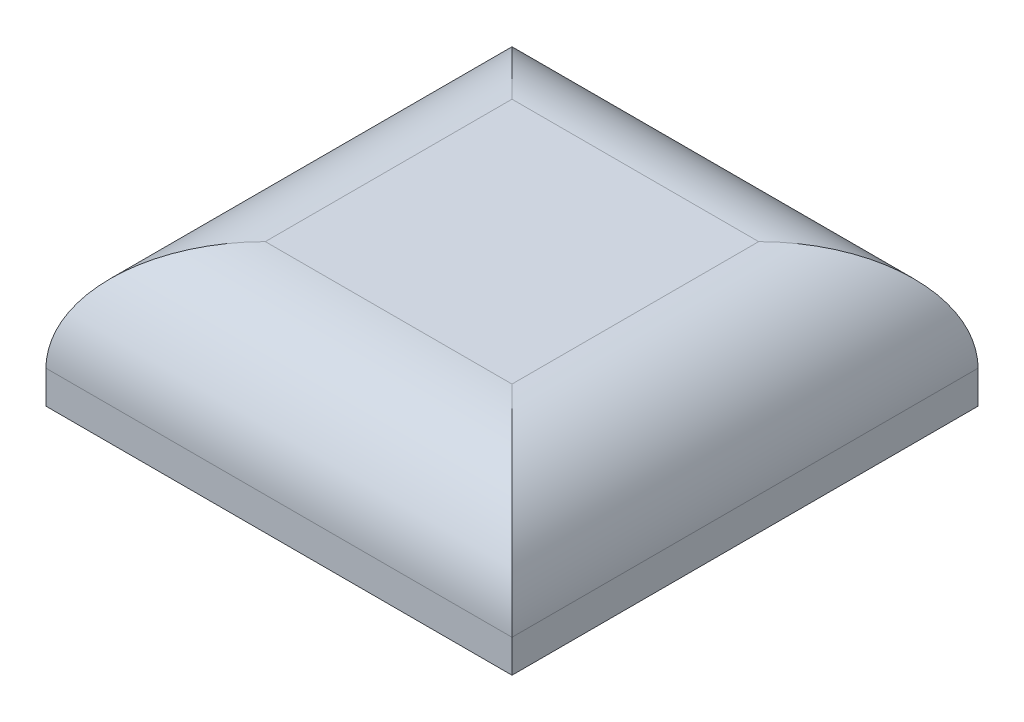
ISO-10303-21;
HEADER;
FILE_DESCRIPTION(('STEP AP214'),'2;1');
FILE_NAME('part.step','',(''),(''),'','','');
FILE_SCHEMA(('AUTOMOTIVE_DESIGN { 1 0 10303 214 1 1 1 1 }'));
ENDSEC;
DATA;
#1=APPLICATION_CONTEXT('core data for automotive mechanical design processes');
#2=APPLICATION_PROTOCOL_DEFINITION('international standard','automotive_design',2000,#1);
#3=PRODUCT_CONTEXT('',#1,'mechanical');
#4=PRODUCT('Part','Part','',(#3));
#5=PRODUCT_RELATED_PRODUCT_CATEGORY('part','',(#4));
#6=PRODUCT_DEFINITION_FORMATION('','',#4);
#7=PRODUCT_DEFINITION_CONTEXT('part definition',#1,'design');
#8=PRODUCT_DEFINITION('design','',#6,#7);
#9=PRODUCT_DEFINITION_SHAPE('','',#8);
#10=(LENGTH_UNIT() NAMED_UNIT(*) SI_UNIT(.MILLI.,.METRE.));
#11=(NAMED_UNIT(*) PLANE_ANGLE_UNIT() SI_UNIT($,.RADIAN.));
#12=(NAMED_UNIT(*) SI_UNIT($,.STERADIAN.) SOLID_ANGLE_UNIT());
#13=UNCERTAINTY_MEASURE_WITH_UNIT(LENGTH_MEASURE(1.E-05),#10,'distance_accuracy_value','');
#14=(GEOMETRIC_REPRESENTATION_CONTEXT(3) GLOBAL_UNCERTAINTY_ASSIGNED_CONTEXT((#13)) GLOBAL_UNIT_ASSIGNED_CONTEXT((#10,
#11,#12)) REPRESENTATION_CONTEXT('',''));
#15=CARTESIAN_POINT('',(0.,0.,0.));
#16=DIRECTION('',(0.,0.,1.));
#17=DIRECTION('',(1.,0.,0.));
#18=AXIS2_PLACEMENT_3D('',#15,#16,#17);
#19=CARTESIAN_POINT('',(21.25,13.,21.25));
#20=DIRECTION('',(-1.,0.,0.));
#21=DIRECTION('',(0.,0.,1.));
#22=AXIS2_PLACEMENT_3D('',#19,#20,#21);
#23=PLANE('',#22);
#24=DIRECTION('',(0.,-1.,0.));
#25=VECTOR('',#24,1.);
#26=CARTESIAN_POINT('',(21.25,13.,-21.25));
#27=LINE('',#26,#25);
#28=CARTESIAN_POINT('',(21.25,3.,-21.25));
#29=VERTEX_POINT('',#28);
#30=CARTESIAN_POINT('',(21.25,0.,-21.25));
#31=VERTEX_POINT('',#30);
#32=EDGE_CURVE('E85',#29,#31,#27,.T.);
#33=ORIENTED_EDGE('',*,*,#32,.F.);
#34=DIRECTION('',(0.,0.,-1.));
#35=VECTOR('',#34,1.);
#36=CARTESIAN_POINT('',(21.25,3.,21.25));
#37=LINE('',#36,#35);
#38=CARTESIAN_POINT('',(21.25,3.,21.25));
#39=VERTEX_POINT('',#38);
#40=EDGE_CURVE('E11',#29,#39,#37,.F.);
#41=ORIENTED_EDGE('',*,*,#40,.T.);
#42=DIRECTION('',(0.,-1.,0.));
#43=VECTOR('',#42,1.);
#44=CARTESIAN_POINT('',(21.25,13.,21.25));
#45=LINE('',#44,#43);
#46=CARTESIAN_POINT('',(21.25,0.,21.25));
#47=VERTEX_POINT('',#46);
#48=EDGE_CURVE('E105',#39,#47,#45,.T.);
#49=ORIENTED_EDGE('',*,*,#48,.T.);
#50=DIRECTION('',(0.,0.,-1.));
#51=VECTOR('',#50,1.);
#52=CARTESIAN_POINT('',(21.25,0.,21.25));
#53=LINE('',#52,#51);
#54=EDGE_CURVE('E100',#47,#31,#53,.T.);
#55=ORIENTED_EDGE('',*,*,#54,.T.);
#56=EDGE_LOOP('',(#33,#41,#49,#55));
#57=FACE_BOUND('',#56,.T.);
#58=ADVANCED_FACE('F33',(#57),#23,.F.);
#59=CARTESIAN_POINT('',(-21.25,13.,-21.25));
#60=DIRECTION('',(0.,0.,1.));
#61=DIRECTION('',(1.,0.,0.));
#62=AXIS2_PLACEMENT_3D('',#59,#60,#61);
#63=PLANE('',#62);
#64=DIRECTION('',(0.,-1.,0.));
#65=VECTOR('',#64,1.);
#66=CARTESIAN_POINT('',(-21.25,13.,-21.25));
#67=LINE('',#66,#65);
#68=CARTESIAN_POINT('',(-21.25,3.,-21.25));
#69=VERTEX_POINT('',#68);
#70=CARTESIAN_POINT('',(-21.25,0.,-21.25));
#71=VERTEX_POINT('',#70);
#72=EDGE_CURVE('E94',#69,#71,#67,.T.);
#73=ORIENTED_EDGE('',*,*,#72,.F.);
#74=DIRECTION('',(-1.,0.,0.));
#75=VECTOR('',#74,1.);
#76=CARTESIAN_POINT('',(-21.25,3.,-21.25));
#77=LINE('',#76,#75);
#78=EDGE_CURVE('E42',#69,#29,#77,.F.);
#79=ORIENTED_EDGE('',*,*,#78,.T.);
#80=ORIENTED_EDGE('',*,*,#32,.T.);
#81=DIRECTION('',(-1.,0.,0.));
#82=VECTOR('',#81,1.);
#83=CARTESIAN_POINT('',(-21.25,0.,-21.25));
#84=LINE('',#83,#82);
#85=EDGE_CURVE('E88',#31,#71,#84,.T.);
#86=ORIENTED_EDGE('',*,*,#85,.T.);
#87=EDGE_LOOP('',(#73,#79,#80,#86));
#88=FACE_BOUND('',#87,.T.);
#89=ADVANCED_FACE('F87',(#88),#63,.F.);
#90=CARTESIAN_POINT('',(-21.25,13.,21.25));
#91=DIRECTION('',(1.,0.,0.));
#92=DIRECTION('',(0.,0.,-1.));
#93=AXIS2_PLACEMENT_3D('',#90,#91,#92);
#94=PLANE('',#93);
#95=DIRECTION('',(0.,-1.,0.));
#96=VECTOR('',#95,1.);
#97=CARTESIAN_POINT('',(-21.25,13.,21.25));
#98=LINE('',#97,#96);
#99=CARTESIAN_POINT('',(-21.25,3.,21.25));
#100=VERTEX_POINT('',#99);
#101=CARTESIAN_POINT('',(-21.25,0.,21.25));
#102=VERTEX_POINT('',#101);
#103=EDGE_CURVE('E115',#100,#102,#98,.T.);
#104=ORIENTED_EDGE('',*,*,#103,.F.);
#105=DIRECTION('',(0.,0.,1.));
#106=VECTOR('',#105,1.);
#107=CARTESIAN_POINT('',(-21.25,3.,21.25));
#108=LINE('',#107,#106);
#109=EDGE_CURVE('E57',#100,#69,#108,.F.);
#110=ORIENTED_EDGE('',*,*,#109,.T.);
#111=ORIENTED_EDGE('',*,*,#72,.T.);
#112=DIRECTION('',(0.,0.,1.));
#113=VECTOR('',#112,1.);
#114=CARTESIAN_POINT('',(-21.25,0.,21.25));
#115=LINE('',#114,#113);
#116=EDGE_CURVE('E102',#71,#102,#115,.T.);
#117=ORIENTED_EDGE('',*,*,#116,.T.);
#118=EDGE_LOOP('',(#104,#110,#111,#117));
#119=FACE_BOUND('',#118,.T.);
#120=ADVANCED_FACE('F153',(#119),#94,.F.);
#121=CARTESIAN_POINT('',(-21.25,13.,21.25));
#122=DIRECTION('',(0.,0.,-1.));
#123=DIRECTION('',(-1.,0.,0.));
#124=AXIS2_PLACEMENT_3D('',#121,#122,#123);
#125=PLANE('',#124);
#126=ORIENTED_EDGE('',*,*,#48,.F.);
#127=DIRECTION('',(1.,0.,0.));
#128=VECTOR('',#127,1.);
#129=CARTESIAN_POINT('',(-21.25,3.,21.25));
#130=LINE('',#129,#128);
#131=EDGE_CURVE('E126',#39,#100,#130,.F.);
#132=ORIENTED_EDGE('',*,*,#131,.T.);
#133=ORIENTED_EDGE('',*,*,#103,.T.);
#134=DIRECTION('',(1.,0.,0.));
#135=VECTOR('',#134,1.);
#136=CARTESIAN_POINT('',(-21.25,0.,21.25));
#137=LINE('',#136,#135);
#138=EDGE_CURVE('E112',#102,#47,#137,.T.);
#139=ORIENTED_EDGE('',*,*,#138,.T.);
#140=EDGE_LOOP('',(#126,#132,#133,#139));
#141=FACE_BOUND('',#140,.T.);
#142=ADVANCED_FACE('F152',(#141),#125,.F.);
#143=CARTESIAN_POINT('',(0.,13.,0.));
#144=DIRECTION('',(0.,-1.,0.));
#145=DIRECTION('',(0.,0.,-1.));
#146=AXIS2_PLACEMENT_3D('',#143,#144,#145);
#147=PLANE('',#146);
#148=DIRECTION('',(0.,0.,1.));
#149=VECTOR('',#148,1.);
#150=CARTESIAN_POINT('',(-11.25,13.,0.));
#151=LINE('',#150,#149);
#152=CARTESIAN_POINT('',(-11.25,13.,-11.25));
#153=VERTEX_POINT('',#152);
#154=CARTESIAN_POINT('',(-11.25,13.,11.25));
#155=VERTEX_POINT('',#154);
#156=EDGE_CURVE('E121',#153,#155,#151,.T.);
#157=ORIENTED_EDGE('',*,*,#156,.T.);
#158=DIRECTION('',(1.,0.,0.));
#159=VECTOR('',#158,1.);
#160=CARTESIAN_POINT('',(0.,13.,11.25));
#161=LINE('',#160,#159);
#162=CARTESIAN_POINT('',(11.25,13.,11.25));
#163=VERTEX_POINT('',#162);
#164=EDGE_CURVE('E123',#155,#163,#161,.T.);
#165=ORIENTED_EDGE('',*,*,#164,.T.);
#166=DIRECTION('',(0.,0.,-1.));
#167=VECTOR('',#166,1.);
#168=CARTESIAN_POINT('',(11.25,13.,0.));
#169=LINE('',#168,#167);
#170=CARTESIAN_POINT('',(11.25,13.,-11.25));
#171=VERTEX_POINT('',#170);
#172=EDGE_CURVE('E93',#163,#171,#169,.T.);
#173=ORIENTED_EDGE('',*,*,#172,.T.);
#174=DIRECTION('',(-1.,0.,0.));
#175=VECTOR('',#174,1.);
#176=CARTESIAN_POINT('',(0.,13.,-11.25));
#177=LINE('',#176,#175);
#178=EDGE_CURVE('E119',#171,#153,#177,.T.);
#179=ORIENTED_EDGE('',*,*,#178,.T.);
#180=EDGE_LOOP('',(#157,#165,#173,#179));
#181=FACE_BOUND('',#180,.T.);
#182=ADVANCED_FACE('F145',(#181),#147,.F.);
#183=CARTESIAN_POINT('',(0.,0.,0.));
#184=DIRECTION('',(0.,-1.,0.));
#185=DIRECTION('',(0.,0.,-1.));
#186=AXIS2_PLACEMENT_3D('',#183,#184,#185);
#187=PLANE('',#186);
#188=ORIENTED_EDGE('',*,*,#54,.F.);
#189=ORIENTED_EDGE('',*,*,#138,.F.);
#190=ORIENTED_EDGE('',*,*,#116,.F.);
#191=ORIENTED_EDGE('',*,*,#85,.F.);
#192=EDGE_LOOP('',(#188,#189,#190,#191));
#193=FACE_BOUND('',#192,.T.);
#194=ADVANCED_FACE('F98',(#193),#187,.T.);
#195=CARTESIAN_POINT('',(0.,3.,-11.25));
#196=DIRECTION('',(-1.,0.,0.));
#197=DIRECTION('',(0.,0.,1.));
#198=AXIS2_PLACEMENT_3D('',#195,#196,#197);
#199=CYLINDRICAL_SURFACE('',#198,10.);
#200=CARTESIAN_POINT('',(11.25,3.,-11.25));
#201=DIRECTION('',(-0.707106781186547,0.,-0.707106781186547));
#202=DIRECTION('',(0.707106781186547,0.,-0.707106781186547));
#203=AXIS2_PLACEMENT_3D('',#200,#201,#202);
#204=ELLIPSE('',#203,14.1421356237309,10.);
#205=EDGE_CURVE('E109',#29,#171,#204,.F.);
#206=ORIENTED_EDGE('',*,*,#205,.F.);
#207=ORIENTED_EDGE('',*,*,#78,.F.);
#208=CARTESIAN_POINT('',(-11.25,3.,-11.25));
#209=DIRECTION('',(-0.707106781186547,0.,0.707106781186547));
#210=DIRECTION('',(-0.707106781186547,0.,-0.707106781186547));
#211=AXIS2_PLACEMENT_3D('',#208,#209,#210);
#212=ELLIPSE('',#211,14.1421356237309,10.);
#213=EDGE_CURVE('E37',#153,#69,#212,.T.);
#214=ORIENTED_EDGE('',*,*,#213,.F.);
#215=ORIENTED_EDGE('',*,*,#178,.F.);
#216=EDGE_LOOP('',(#206,#207,#214,#215));
#217=FACE_BOUND('',#216,.T.);
#218=ADVANCED_FACE('F35',(#217),#199,.T.);
#219=CARTESIAN_POINT('',(-11.25,3.,0.));
#220=DIRECTION('',(0.,0.,1.));
#221=DIRECTION('',(1.,0.,0.));
#222=AXIS2_PLACEMENT_3D('',#219,#220,#221);
#223=CYLINDRICAL_SURFACE('',#222,10.);
#224=ORIENTED_EDGE('',*,*,#213,.T.);
#225=ORIENTED_EDGE('',*,*,#109,.F.);
#226=CARTESIAN_POINT('',(-11.25,3.,11.25));
#227=DIRECTION('',(0.707106781186547,0.,0.707106781186547));
#228=DIRECTION('',(-0.707106781186547,0.,0.707106781186547));
#229=AXIS2_PLACEMENT_3D('',#226,#227,#228);
#230=ELLIPSE('',#229,14.1421356237309,10.);
#231=EDGE_CURVE('E133',#155,#100,#230,.T.);
#232=ORIENTED_EDGE('',*,*,#231,.F.);
#233=ORIENTED_EDGE('',*,*,#156,.F.);
#234=EDGE_LOOP('',(#224,#225,#232,#233));
#235=FACE_BOUND('',#234,.T.);
#236=ADVANCED_FACE('F170',(#235),#223,.T.);
#237=CARTESIAN_POINT('',(11.25,3.,0.));
#238=DIRECTION('',(0.,0.,-1.));
#239=DIRECTION('',(-1.,0.,0.));
#240=AXIS2_PLACEMENT_3D('',#237,#238,#239);
#241=CYLINDRICAL_SURFACE('',#240,10.);
#242=ORIENTED_EDGE('',*,*,#205,.T.);
#243=ORIENTED_EDGE('',*,*,#172,.F.);
#244=CARTESIAN_POINT('',(11.25,3.,11.25));
#245=DIRECTION('',(0.707106781186547,0.,-0.707106781186547));
#246=DIRECTION('',(-0.707106781186547,0.,-0.707106781186547));
#247=AXIS2_PLACEMENT_3D('',#244,#245,#246);
#248=ELLIPSE('',#247,14.1421356237309,10.);
#249=EDGE_CURVE('E131',#39,#163,#248,.F.);
#250=ORIENTED_EDGE('',*,*,#249,.F.);
#251=ORIENTED_EDGE('',*,*,#40,.F.);
#252=EDGE_LOOP('',(#242,#243,#250,#251));
#253=FACE_BOUND('',#252,.T.);
#254=ADVANCED_FACE('F138',(#253),#241,.T.);
#255=CARTESIAN_POINT('',(0.,3.,11.25));
#256=DIRECTION('',(1.,0.,0.));
#257=DIRECTION('',(0.,0.,-1.));
#258=AXIS2_PLACEMENT_3D('',#255,#256,#257);
#259=CYLINDRICAL_SURFACE('',#258,10.);
#260=ORIENTED_EDGE('',*,*,#231,.T.);
#261=ORIENTED_EDGE('',*,*,#131,.F.);
#262=ORIENTED_EDGE('',*,*,#249,.T.);
#263=ORIENTED_EDGE('',*,*,#164,.F.);
#264=EDGE_LOOP('',(#260,#261,#262,#263));
#265=FACE_BOUND('',#264,.T.);
#266=ADVANCED_FACE('F149',(#265),#259,.T.);
#267=CLOSED_SHELL('',(#58,#89,#120,#142,#182,#194,#218,#236,#254,#266));
#268=MANIFOLD_SOLID_BREP('B2',#267);
#269=ADVANCED_BREP_SHAPE_REPRESENTATION('',(#18,#268),#14);
#270=SHAPE_DEFINITION_REPRESENTATION(#9,#269);
ENDSEC;
END-ISO-10303-21;
